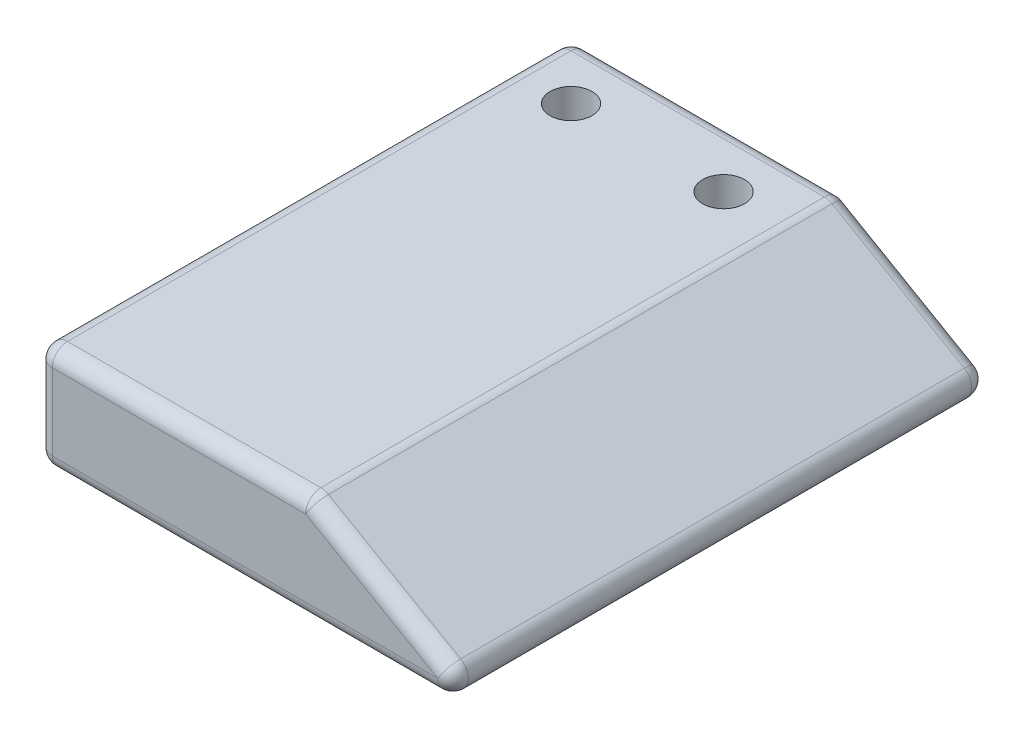
ISO-10303-21;
HEADER;
FILE_DESCRIPTION(('STEP AP214'),'2;1');
FILE_NAME('part.step','',(''),(''),'','','');
FILE_SCHEMA(('AUTOMOTIVE_DESIGN { 1 0 10303 214 1 1 1 1 }'));
ENDSEC;
DATA;
#1=APPLICATION_CONTEXT('core data for automotive mechanical design processes');
#2=APPLICATION_PROTOCOL_DEFINITION('international standard','automotive_design',2000,#1);
#3=PRODUCT_CONTEXT('',#1,'mechanical');
#4=PRODUCT('Part','Part','',(#3));
#5=PRODUCT_RELATED_PRODUCT_CATEGORY('part','',(#4));
#6=PRODUCT_DEFINITION_FORMATION('','',#4);
#7=PRODUCT_DEFINITION_CONTEXT('part definition',#1,'design');
#8=PRODUCT_DEFINITION('design','',#6,#7);
#9=PRODUCT_DEFINITION_SHAPE('','',#8);
#10=(LENGTH_UNIT() NAMED_UNIT(*) SI_UNIT(.MILLI.,.METRE.));
#11=(NAMED_UNIT(*) PLANE_ANGLE_UNIT() SI_UNIT($,.RADIAN.));
#12=(NAMED_UNIT(*) SI_UNIT($,.STERADIAN.) SOLID_ANGLE_UNIT());
#13=UNCERTAINTY_MEASURE_WITH_UNIT(LENGTH_MEASURE(1.E-05),#10,'distance_accuracy_value','');
#14=(GEOMETRIC_REPRESENTATION_CONTEXT(3) GLOBAL_UNCERTAINTY_ASSIGNED_CONTEXT((#13)) GLOBAL_UNIT_ASSIGNED_CONTEXT((#10,
#11,#12)) REPRESENTATION_CONTEXT('',''));
#15=CARTESIAN_POINT('',(0.,0.,0.));
#16=DIRECTION('',(0.,0.,1.));
#17=DIRECTION('',(1.,0.,0.));
#18=AXIS2_PLACEMENT_3D('',#15,#16,#17);
#19=CARTESIAN_POINT('',(60.,0.,70.));
#20=DIRECTION('',(0.,1.,0.));
#21=DIRECTION('',(0.,0.,1.));
#22=AXIS2_PLACEMENT_3D('',#19,#20,#21);
#23=PLANE('',#22);
#24=DIRECTION('',(1.,0.,0.));
#25=VECTOR('',#24,1.);
#26=CARTESIAN_POINT('',(60.,0.,2.));
#27=LINE('',#26,#25);
#28=CARTESIAN_POINT('',(2.,0.,2.));
#29=VERTEX_POINT('',#28);
#30=CARTESIAN_POINT('',(52.5358983848623,0.,2.));
#31=VERTEX_POINT('',#30);
#32=EDGE_CURVE('E187',#29,#31,#27,.T.);
#33=ORIENTED_EDGE('',*,*,#32,.T.);
#34=DIRECTION('',(0.,0.,-1.));
#35=VECTOR('',#34,1.);
#36=CARTESIAN_POINT('',(52.5358983848623,0.,70.));
#37=LINE('',#36,#35);
#38=CARTESIAN_POINT('',(52.5358983848623,0.,68.));
#39=VERTEX_POINT('',#38);
#40=EDGE_CURVE('E190',#31,#39,#37,.F.);
#41=ORIENTED_EDGE('',*,*,#40,.T.);
#42=DIRECTION('',(1.,0.,0.));
#43=VECTOR('',#42,1.);
#44=CARTESIAN_POINT('',(60.,0.,68.));
#45=LINE('',#44,#43);
#46=CARTESIAN_POINT('',(2.,0.,68.));
#47=VERTEX_POINT('',#46);
#48=EDGE_CURVE('E184',#39,#47,#45,.F.);
#49=ORIENTED_EDGE('',*,*,#48,.T.);
#50=DIRECTION('',(0.,0.,-1.));
#51=VECTOR('',#50,1.);
#52=CARTESIAN_POINT('',(2.,0.,70.));
#53=LINE('',#52,#51);
#54=EDGE_CURVE('E181',#47,#29,#53,.T.);
#55=ORIENTED_EDGE('',*,*,#54,.T.);
#56=EDGE_LOOP('',(#33,#41,#49,#55));
#57=FACE_BOUND('',#56,.T.);
#58=CARTESIAN_POINT('',(8.,0.,8.));
#59=DIRECTION('',(0.,-1.,0.));
#60=DIRECTION('',(0.,0.,-1.));
#61=AXIS2_PLACEMENT_3D('',#58,#59,#60);
#62=CIRCLE('',#61,5.6);
#63=CARTESIAN_POINT('',(8.,0.,2.4));
#64=VERTEX_POINT('',#63);
#65=EDGE_CURVE('E314',#64,#64,#62,.T.);
#66=ORIENTED_EDGE('',*,*,#65,.F.);
#67=EDGE_LOOP('',(#66));
#68=FACE_BOUND('',#67,.T.);
#69=CARTESIAN_POINT('',(28.,0.,8.));
#70=DIRECTION('',(0.,-1.,0.));
#71=DIRECTION('',(0.,0.,-1.));
#72=AXIS2_PLACEMENT_3D('',#69,#70,#71);
#73=CIRCLE('',#72,5.6);
#74=CARTESIAN_POINT('',(28.,0.,2.4));
#75=VERTEX_POINT('',#74);
#76=EDGE_CURVE('E333',#75,#75,#73,.T.);
#77=ORIENTED_EDGE('',*,*,#76,.F.);
#78=EDGE_LOOP('',(#77));
#79=FACE_BOUND('',#78,.T.);
#80=ADVANCED_FACE('F38',(#57,#68,#79),#23,.F.);
#81=CARTESIAN_POINT('',(35.7512886940358,14.,70.));
#82=DIRECTION('',(-0.500000000000001,-0.866025403784438,0.));
#83=DIRECTION('',(0.866025403784438,-0.500000000000001,0.));
#84=AXIS2_PLACEMENT_3D('',#81,#82,#83);
#85=PLANE('',#84);
#86=DIRECTION('',(0.,0.,-1.));
#87=VECTOR('',#86,1.);
#88=CARTESIAN_POINT('',(53.5358983848623,3.73205080756888,70.));
#89=LINE('',#88,#87);
#90=CARTESIAN_POINT('',(53.5358983848623,3.73205080756887,68.));
#91=VERTEX_POINT('',#90);
#92=CARTESIAN_POINT('',(53.5358983848623,3.73205080756887,2.));
#93=VERTEX_POINT('',#92);
#94=EDGE_CURVE('E139',#91,#93,#89,.T.);
#95=ORIENTED_EDGE('',*,*,#94,.T.);
#96=DIRECTION('',(-0.866025403784438,0.500000000000001,0.));
#97=VECTOR('',#96,1.);
#98=CARTESIAN_POINT('',(35.7512886940358,14.,2.));
#99=LINE('',#98,#97);
#100=CARTESIAN_POINT('',(36.2153903091736,13.7320508075689,2.));
#101=VERTEX_POINT('',#100);
#102=EDGE_CURVE('E134',#93,#101,#99,.T.);
#103=ORIENTED_EDGE('',*,*,#102,.T.);
#104=DIRECTION('',(0.,0.,-1.));
#105=VECTOR('',#104,1.);
#106=CARTESIAN_POINT('',(36.2153903091736,13.7320508075689,70.));
#107=LINE('',#106,#105);
#108=CARTESIAN_POINT('',(36.2153903091736,13.7320508075689,68.));
#109=VERTEX_POINT('',#108);
#110=EDGE_CURVE('E126',#101,#109,#107,.F.);
#111=ORIENTED_EDGE('',*,*,#110,.T.);
#112=DIRECTION('',(-0.866025403784438,0.500000000000001,0.));
#113=VECTOR('',#112,1.);
#114=CARTESIAN_POINT('',(35.7512886940358,14.,68.));
#115=LINE('',#114,#113);
#116=EDGE_CURVE('E131',#109,#91,#115,.F.);
#117=ORIENTED_EDGE('',*,*,#116,.T.);
#118=EDGE_LOOP('',(#95,#103,#111,#117));
#119=FACE_BOUND('',#118,.T.);
#120=ADVANCED_FACE('F129',(#119),#85,.F.);
#121=CARTESIAN_POINT('',(0.,14.,70.));
#122=DIRECTION('',(0.,-1.,0.));
#123=DIRECTION('',(0.,0.,-1.));
#124=AXIS2_PLACEMENT_3D('',#121,#122,#123);
#125=PLANE('',#124);
#126=DIRECTION('',(-1.,0.,0.));
#127=VECTOR('',#126,1.);
#128=CARTESIAN_POINT('',(0.,14.,68.));
#129=LINE('',#128,#127);
#130=CARTESIAN_POINT('',(2.,14.,68.));
#131=VERTEX_POINT('',#130);
#132=CARTESIAN_POINT('',(35.2153903091736,14.,68.));
#133=VERTEX_POINT('',#132);
#134=EDGE_CURVE('E197',#131,#133,#129,.F.);
#135=ORIENTED_EDGE('',*,*,#134,.T.);
#136=DIRECTION('',(0.,0.,-1.));
#137=VECTOR('',#136,1.);
#138=CARTESIAN_POINT('',(35.2153903091736,14.,70.));
#139=LINE('',#138,#137);
#140=CARTESIAN_POINT('',(35.2153903091736,14.,2.));
#141=VERTEX_POINT('',#140);
#142=EDGE_CURVE('E147',#133,#141,#139,.T.);
#143=ORIENTED_EDGE('',*,*,#142,.T.);
#144=DIRECTION('',(-1.,0.,0.));
#145=VECTOR('',#144,1.);
#146=CARTESIAN_POINT('',(0.,14.,2.));
#147=LINE('',#146,#145);
#148=CARTESIAN_POINT('',(2.,14.,2.));
#149=VERTEX_POINT('',#148);
#150=EDGE_CURVE('E200',#141,#149,#147,.T.);
#151=ORIENTED_EDGE('',*,*,#150,.T.);
#152=DIRECTION('',(0.,0.,-1.));
#153=VECTOR('',#152,1.);
#154=CARTESIAN_POINT('',(2.,14.,70.));
#155=LINE('',#154,#153);
#156=EDGE_CURVE('E194',#149,#131,#155,.F.);
#157=ORIENTED_EDGE('',*,*,#156,.T.);
#158=EDGE_LOOP('',(#135,#143,#151,#157));
#159=FACE_BOUND('',#158,.T.);
#160=CARTESIAN_POINT('',(8.,14.,8.));
#161=DIRECTION('',(0.,-1.,0.));
#162=DIRECTION('',(0.,0.,-1.));
#163=AXIS2_PLACEMENT_3D('',#160,#161,#162);
#164=CIRCLE('',#163,2.75);
#165=CARTESIAN_POINT('',(8.,14.,5.25));
#166=VERTEX_POINT('',#165);
#167=EDGE_CURVE('E327',#166,#166,#164,.T.);
#168=ORIENTED_EDGE('',*,*,#167,.T.);
#169=EDGE_LOOP('',(#168));
#170=FACE_BOUND('',#169,.T.);
#171=CARTESIAN_POINT('',(28.,14.,8.));
#172=DIRECTION('',(0.,-1.,0.));
#173=DIRECTION('',(0.,0.,-1.));
#174=AXIS2_PLACEMENT_3D('',#171,#172,#173);
#175=CIRCLE('',#174,2.75);
#176=CARTESIAN_POINT('',(28.,14.,5.25));
#177=VERTEX_POINT('',#176);
#178=EDGE_CURVE('E169',#177,#177,#175,.T.);
#179=ORIENTED_EDGE('',*,*,#178,.T.);
#180=EDGE_LOOP('',(#179));
#181=FACE_BOUND('',#180,.T.);
#182=ADVANCED_FACE('F356',(#159,#170,#181),#125,.F.);
#183=CARTESIAN_POINT('',(0.,0.,70.));
#184=DIRECTION('',(1.,0.,0.));
#185=DIRECTION('',(0.,0.,-1.));
#186=AXIS2_PLACEMENT_3D('',#183,#184,#185);
#187=PLANE('',#186);
#188=DIRECTION('',(0.,-1.,0.));
#189=VECTOR('',#188,1.);
#190=CARTESIAN_POINT('',(0.,0.,68.));
#191=LINE('',#190,#189);
#192=CARTESIAN_POINT('',(0.,2.,68.));
#193=VERTEX_POINT('',#192);
#194=CARTESIAN_POINT('',(0.,12.,68.));
#195=VERTEX_POINT('',#194);
#196=EDGE_CURVE('E48',#193,#195,#191,.F.);
#197=ORIENTED_EDGE('',*,*,#196,.T.);
#198=DIRECTION('',(0.,0.,-1.));
#199=VECTOR('',#198,1.);
#200=CARTESIAN_POINT('',(0.,12.,70.));
#201=LINE('',#200,#199);
#202=CARTESIAN_POINT('',(0.,12.,2.));
#203=VERTEX_POINT('',#202);
#204=EDGE_CURVE('E11',#195,#203,#201,.T.);
#205=ORIENTED_EDGE('',*,*,#204,.T.);
#206=DIRECTION('',(0.,-1.,0.));
#207=VECTOR('',#206,1.);
#208=CARTESIAN_POINT('',(0.,0.,2.));
#209=LINE('',#208,#207);
#210=CARTESIAN_POINT('',(0.,2.,2.));
#211=VERTEX_POINT('',#210);
#212=EDGE_CURVE('E231',#203,#211,#209,.T.);
#213=ORIENTED_EDGE('',*,*,#212,.T.);
#214=DIRECTION('',(0.,0.,-1.));
#215=VECTOR('',#214,1.);
#216=CARTESIAN_POINT('',(0.,2.,70.));
#217=LINE('',#216,#215);
#218=EDGE_CURVE('E59',#211,#193,#217,.F.);
#219=ORIENTED_EDGE('',*,*,#218,.T.);
#220=EDGE_LOOP('',(#197,#205,#213,#219));
#221=FACE_BOUND('',#220,.T.);
#222=ADVANCED_FACE('F438',(#221),#187,.F.);
#223=CARTESIAN_POINT('',(0.,0.,70.));
#224=DIRECTION('',(0.,0.,-1.));
#225=DIRECTION('',(-1.,0.,0.));
#226=AXIS2_PLACEMENT_3D('',#223,#224,#225);
#227=PLANE('',#226);
#228=DIRECTION('',(-0.866025403784438,0.500000000000001,0.));
#229=VECTOR('',#228,1.);
#230=CARTESIAN_POINT('',(14.0000000000001,24.2487113059643,70.));
#231=LINE('',#230,#229);
#232=CARTESIAN_POINT('',(52.5358983848623,2.,70.));
#233=VERTEX_POINT('',#232);
#234=CARTESIAN_POINT('',(35.2153903091736,12.,70.));
#235=VERTEX_POINT('',#234);
#236=EDGE_CURVE('E224',#233,#235,#231,.T.);
#237=ORIENTED_EDGE('',*,*,#236,.T.);
#238=DIRECTION('',(-1.,0.,0.));
#239=VECTOR('',#238,1.);
#240=CARTESIAN_POINT('',(0.,12.,70.));
#241=LINE('',#240,#239);
#242=CARTESIAN_POINT('',(2.,12.,70.));
#243=VERTEX_POINT('',#242);
#244=EDGE_CURVE('E227',#235,#243,#241,.T.);
#245=ORIENTED_EDGE('',*,*,#244,.T.);
#246=DIRECTION('',(0.,-1.,0.));
#247=VECTOR('',#246,1.);
#248=CARTESIAN_POINT('',(2.,0.,70.));
#249=LINE('',#248,#247);
#250=CARTESIAN_POINT('',(2.,2.,70.));
#251=VERTEX_POINT('',#250);
#252=EDGE_CURVE('E218',#243,#251,#249,.T.);
#253=ORIENTED_EDGE('',*,*,#252,.T.);
#254=DIRECTION('',(1.,0.,0.));
#255=VECTOR('',#254,1.);
#256=CARTESIAN_POINT('',(0.,2.,70.));
#257=LINE('',#256,#255);
#258=EDGE_CURVE('E221',#251,#233,#257,.T.);
#259=ORIENTED_EDGE('',*,*,#258,.T.);
#260=EDGE_LOOP('',(#237,#245,#253,#259));
#261=FACE_BOUND('',#260,.T.);
#262=ADVANCED_FACE('F455',(#261),#227,.F.);
#263=CARTESIAN_POINT('',(0.,0.,0.));
#264=DIRECTION('',(0.,0.,-1.));
#265=DIRECTION('',(-1.,0.,0.));
#266=AXIS2_PLACEMENT_3D('',#263,#264,#265);
#267=PLANE('',#266);
#268=DIRECTION('',(-1.,0.,0.));
#269=VECTOR('',#268,1.);
#270=CARTESIAN_POINT('',(35.7512886940358,12.,0.));
#271=LINE('',#270,#269);
#272=CARTESIAN_POINT('',(2.,12.,0.));
#273=VERTEX_POINT('',#272);
#274=CARTESIAN_POINT('',(35.2153903091736,12.,0.));
#275=VERTEX_POINT('',#274);
#276=EDGE_CURVE('E211',#273,#275,#271,.F.);
#277=ORIENTED_EDGE('',*,*,#276,.T.);
#278=DIRECTION('',(-0.866025403784438,0.500000000000001,0.));
#279=VECTOR('',#278,1.);
#280=CARTESIAN_POINT('',(59.,-1.73205080756888,0.));
#281=LINE('',#280,#279);
#282=CARTESIAN_POINT('',(52.5358983848623,2.,0.));
#283=VERTEX_POINT('',#282);
#284=EDGE_CURVE('E214',#275,#283,#281,.F.);
#285=ORIENTED_EDGE('',*,*,#284,.T.);
#286=DIRECTION('',(1.,0.,0.));
#287=VECTOR('',#286,1.);
#288=CARTESIAN_POINT('',(0.,2.,0.));
#289=LINE('',#288,#287);
#290=CARTESIAN_POINT('',(2.,2.,0.));
#291=VERTEX_POINT('',#290);
#292=EDGE_CURVE('E208',#283,#291,#289,.F.);
#293=ORIENTED_EDGE('',*,*,#292,.T.);
#294=DIRECTION('',(0.,-1.,0.));
#295=VECTOR('',#294,1.);
#296=CARTESIAN_POINT('',(2.,14.,0.));
#297=LINE('',#296,#295);
#298=EDGE_CURVE('E205',#291,#273,#297,.F.);
#299=ORIENTED_EDGE('',*,*,#298,.T.);
#300=EDGE_LOOP('',(#277,#285,#293,#299));
#301=FACE_BOUND('',#300,.T.);
#302=ADVANCED_FACE('F457',(#301),#267,.T.);
#303=CARTESIAN_POINT('',(28.,0.,8.));
#304=DIRECTION('',(0.,-1.,0.));
#305=DIRECTION('',(0.,0.,-1.));
#306=AXIS2_PLACEMENT_3D('',#303,#304,#305);
#307=CYLINDRICAL_SURFACE('',#306,2.75);
#308=ORIENTED_EDGE('',*,*,#178,.F.);
#309=EDGE_LOOP('',(#308));
#310=FACE_BOUND('',#309,.T.);
#311=CARTESIAN_POINT('',(28.,2.85,8.));
#312=DIRECTION('',(0.,-1.,0.));
#313=DIRECTION('',(0.,0.,-1.));
#314=AXIS2_PLACEMENT_3D('',#311,#312,#313);
#315=CIRCLE('',#314,2.75);
#316=CARTESIAN_POINT('',(28.,2.85,5.25));
#317=VERTEX_POINT('',#316);
#318=EDGE_CURVE('E173',#317,#317,#315,.T.);
#319=ORIENTED_EDGE('',*,*,#318,.T.);
#320=EDGE_LOOP('',(#319));
#321=FACE_BOUND('',#320,.T.);
#322=ADVANCED_FACE('F340',(#310,#321),#307,.F.);
#323=CARTESIAN_POINT('',(28.,0.,8.));
#324=DIRECTION('',(0.,-1.,0.));
#325=DIRECTION('',(0.,0.,-1.));
#326=AXIS2_PLACEMENT_3D('',#323,#324,#325);
#327=CONICAL_SURFACE('',#326,5.6,0.785398163397449);
#328=ORIENTED_EDGE('',*,*,#318,.F.);
#329=EDGE_LOOP('',(#328));
#330=FACE_BOUND('',#329,.T.);
#331=ORIENTED_EDGE('',*,*,#76,.T.);
#332=EDGE_LOOP('',(#331));
#333=FACE_BOUND('',#332,.T.);
#334=ADVANCED_FACE('F342',(#330,#333),#327,.F.);
#335=CARTESIAN_POINT('',(8.,0.,8.));
#336=DIRECTION('',(0.,-1.,0.));
#337=DIRECTION('',(0.,0.,-1.));
#338=AXIS2_PLACEMENT_3D('',#335,#336,#337);
#339=CYLINDRICAL_SURFACE('',#338,2.75);
#340=ORIENTED_EDGE('',*,*,#167,.F.);
#341=EDGE_LOOP('',(#340));
#342=FACE_BOUND('',#341,.T.);
#343=CARTESIAN_POINT('',(8.,2.85,8.));
#344=DIRECTION('',(0.,-1.,0.));
#345=DIRECTION('',(0.,0.,-1.));
#346=AXIS2_PLACEMENT_3D('',#343,#344,#345);
#347=CIRCLE('',#346,2.75);
#348=CARTESIAN_POINT('',(8.,2.85,5.25));
#349=VERTEX_POINT('',#348);
#350=EDGE_CURVE('E321',#349,#349,#347,.T.);
#351=ORIENTED_EDGE('',*,*,#350,.T.);
#352=EDGE_LOOP('',(#351));
#353=FACE_BOUND('',#352,.T.);
#354=ADVANCED_FACE('F345',(#342,#353),#339,.F.);
#355=CARTESIAN_POINT('',(8.,0.,8.));
#356=DIRECTION('',(0.,-1.,0.));
#357=DIRECTION('',(0.,0.,-1.));
#358=AXIS2_PLACEMENT_3D('',#355,#356,#357);
#359=CONICAL_SURFACE('',#358,5.6,0.785398163397448);
#360=ORIENTED_EDGE('',*,*,#350,.F.);
#361=EDGE_LOOP('',(#360));
#362=FACE_BOUND('',#361,.T.);
#363=ORIENTED_EDGE('',*,*,#65,.T.);
#364=EDGE_LOOP('',(#363));
#365=FACE_BOUND('',#364,.T.);
#366=ADVANCED_FACE('F430',(#362,#365),#359,.F.);
#367=CARTESIAN_POINT('',(2.,12.,70.));
#368=DIRECTION('',(0.,0.,-1.));
#369=DIRECTION('',(-1.,0.,0.));
#370=AXIS2_PLACEMENT_3D('',#367,#368,#369);
#371=CYLINDRICAL_SURFACE('',#370,2.);
#372=CARTESIAN_POINT('',(2.,12.,68.));
#373=DIRECTION('',(0.,0.,1.));
#374=DIRECTION('',(1.,0.,0.));
#375=AXIS2_PLACEMENT_3D('',#372,#373,#374);
#376=CIRCLE('',#375,2.);
#377=EDGE_CURVE('E42',#131,#195,#376,.T.);
#378=ORIENTED_EDGE('',*,*,#377,.F.);
#379=ORIENTED_EDGE('',*,*,#156,.F.);
#380=CARTESIAN_POINT('',(2.,12.,2.));
#381=DIRECTION('',(0.,0.,-1.));
#382=DIRECTION('',(-1.,0.,0.));
#383=AXIS2_PLACEMENT_3D('',#380,#381,#382);
#384=CIRCLE('',#383,2.);
#385=EDGE_CURVE('E305',#203,#149,#384,.T.);
#386=ORIENTED_EDGE('',*,*,#385,.F.);
#387=ORIENTED_EDGE('',*,*,#204,.F.);
#388=EDGE_LOOP('',(#378,#379,#386,#387));
#389=FACE_BOUND('',#388,.T.);
#390=ADVANCED_FACE('F40',(#389),#371,.T.);
#391=CARTESIAN_POINT('',(2.,12.,68.));
#392=DIRECTION('',(0.,0.,1.));
#393=DIRECTION('',(1.,0.,0.));
#394=AXIS2_PLACEMENT_3D('',#391,#392,#393);
#395=SPHERICAL_SURFACE('',#394,2.);
#396=CARTESIAN_POINT('',(2.,12.,68.));
#397=DIRECTION('',(-1.,0.,0.));
#398=DIRECTION('',(0.,0.,1.));
#399=AXIS2_PLACEMENT_3D('',#396,#397,#398);
#400=CIRCLE('',#399,2.);
#401=EDGE_CURVE('E298',#131,#243,#400,.F.);
#402=ORIENTED_EDGE('',*,*,#401,.F.);
#403=ORIENTED_EDGE('',*,*,#377,.T.);
#404=CARTESIAN_POINT('',(2.,12.,68.));
#405=DIRECTION('',(0.,1.,0.));
#406=DIRECTION('',(0.,0.,1.));
#407=AXIS2_PLACEMENT_3D('',#404,#405,#406);
#408=CIRCLE('',#407,2.);
#409=EDGE_CURVE('E302',#243,#195,#408,.F.);
#410=ORIENTED_EDGE('',*,*,#409,.F.);
#411=EDGE_LOOP('',(#402,#403,#410));
#412=FACE_BOUND('',#411,.T.);
#413=ADVANCED_FACE('F425',(#412),#395,.T.);
#414=CARTESIAN_POINT('',(2.,12.,2.));
#415=DIRECTION('',(0.,0.,1.));
#416=DIRECTION('',(1.,0.,0.));
#417=AXIS2_PLACEMENT_3D('',#414,#415,#416);
#418=SPHERICAL_SURFACE('',#417,2.);
#419=CARTESIAN_POINT('',(2.,12.,2.));
#420=DIRECTION('',(0.,1.,0.));
#421=DIRECTION('',(0.,0.,1.));
#422=AXIS2_PLACEMENT_3D('',#419,#420,#421);
#423=CIRCLE('',#422,2.);
#424=EDGE_CURVE('E290',#203,#273,#423,.F.);
#425=ORIENTED_EDGE('',*,*,#424,.F.);
#426=ORIENTED_EDGE('',*,*,#385,.T.);
#427=CARTESIAN_POINT('',(2.,12.,2.));
#428=DIRECTION('',(-1.,0.,0.));
#429=DIRECTION('',(0.,0.,1.));
#430=AXIS2_PLACEMENT_3D('',#427,#428,#429);
#431=CIRCLE('',#430,2.);
#432=EDGE_CURVE('E294',#273,#149,#431,.F.);
#433=ORIENTED_EDGE('',*,*,#432,.F.);
#434=EDGE_LOOP('',(#425,#426,#433));
#435=FACE_BOUND('',#434,.T.);
#436=ADVANCED_FACE('F422',(#435),#418,.T.);
#437=CARTESIAN_POINT('',(2.,0.,68.));
#438=DIRECTION('',(0.,-1.,0.));
#439=DIRECTION('',(0.,0.,-1.));
#440=AXIS2_PLACEMENT_3D('',#437,#438,#439);
#441=CYLINDRICAL_SURFACE('',#440,2.);
#442=ORIENTED_EDGE('',*,*,#409,.T.);
#443=ORIENTED_EDGE('',*,*,#196,.F.);
#444=CARTESIAN_POINT('',(2.,2.,68.));
#445=DIRECTION('',(0.,-1.,0.));
#446=DIRECTION('',(0.,0.,-1.));
#447=AXIS2_PLACEMENT_3D('',#444,#445,#446);
#448=CIRCLE('',#447,2.);
#449=EDGE_CURVE('E282',#251,#193,#448,.T.);
#450=ORIENTED_EDGE('',*,*,#449,.F.);
#451=ORIENTED_EDGE('',*,*,#252,.F.);
#452=EDGE_LOOP('',(#442,#443,#450,#451));
#453=FACE_BOUND('',#452,.T.);
#454=ADVANCED_FACE('F418',(#453),#441,.T.);
#455=CARTESIAN_POINT('',(0.,12.,68.));
#456=DIRECTION('',(-1.,0.,0.));
#457=DIRECTION('',(0.,0.,1.));
#458=AXIS2_PLACEMENT_3D('',#455,#456,#457);
#459=CYLINDRICAL_SURFACE('',#458,2.);
#460=ORIENTED_EDGE('',*,*,#401,.T.);
#461=ORIENTED_EDGE('',*,*,#244,.F.);
#462=CARTESIAN_POINT('',(35.2153903091736,12.,68.));
#463=DIRECTION('',(1.,0.,0.));
#464=DIRECTION('',(0.,0.,-1.));
#465=AXIS2_PLACEMENT_3D('',#462,#463,#464);
#466=CIRCLE('',#465,2.);
#467=EDGE_CURVE('E152',#133,#235,#466,.T.);
#468=ORIENTED_EDGE('',*,*,#467,.F.);
#469=ORIENTED_EDGE('',*,*,#134,.F.);
#470=EDGE_LOOP('',(#460,#461,#468,#469));
#471=FACE_BOUND('',#470,.T.);
#472=ADVANCED_FACE('F415',(#471),#459,.T.);
#473=CARTESIAN_POINT('',(35.2153903091736,12.,70.));
#474=DIRECTION('',(0.,0.,-1.));
#475=DIRECTION('',(-1.,0.,0.));
#476=AXIS2_PLACEMENT_3D('',#473,#474,#475);
#477=CYLINDRICAL_SURFACE('',#476,2.);
#478=CARTESIAN_POINT('',(35.2153903091736,12.,2.));
#479=DIRECTION('',(0.,0.,-1.));
#480=DIRECTION('',(-1.,0.,0.));
#481=AXIS2_PLACEMENT_3D('',#478,#479,#480);
#482=CIRCLE('',#481,2.);
#483=EDGE_CURVE('E153',#141,#101,#482,.T.);
#484=ORIENTED_EDGE('',*,*,#483,.F.);
#485=ORIENTED_EDGE('',*,*,#142,.F.);
#486=CARTESIAN_POINT('',(35.2153903091736,12.,68.));
#487=DIRECTION('',(0.,0.,1.));
#488=DIRECTION('',(1.,0.,0.));
#489=AXIS2_PLACEMENT_3D('',#486,#487,#488);
#490=CIRCLE('',#489,2.);
#491=EDGE_CURVE('E143',#109,#133,#490,.T.);
#492=ORIENTED_EDGE('',*,*,#491,.F.);
#493=ORIENTED_EDGE('',*,*,#110,.F.);
#494=EDGE_LOOP('',(#484,#485,#492,#493));
#495=FACE_BOUND('',#494,.T.);
#496=ADVANCED_FACE('F145',(#495),#477,.T.);
#497=CARTESIAN_POINT('',(0.,12.,2.));
#498=DIRECTION('',(1.,0.,0.));
#499=DIRECTION('',(0.,0.,-1.));
#500=AXIS2_PLACEMENT_3D('',#497,#498,#499);
#501=CYLINDRICAL_SURFACE('',#500,2.);
#502=ORIENTED_EDGE('',*,*,#432,.T.);
#503=ORIENTED_EDGE('',*,*,#150,.F.);
#504=CARTESIAN_POINT('',(35.2153903091736,12.,2.));
#505=DIRECTION('',(1.,0.,0.));
#506=DIRECTION('',(0.,0.,-1.));
#507=AXIS2_PLACEMENT_3D('',#504,#505,#506);
#508=CIRCLE('',#507,2.);
#509=EDGE_CURVE('E275',#275,#141,#508,.T.);
#510=ORIENTED_EDGE('',*,*,#509,.F.);
#511=ORIENTED_EDGE('',*,*,#276,.F.);
#512=EDGE_LOOP('',(#502,#503,#510,#511));
#513=FACE_BOUND('',#512,.T.);
#514=ADVANCED_FACE('F408',(#513),#501,.T.);
#515=CARTESIAN_POINT('',(2.,0.,2.));
#516=DIRECTION('',(0.,1.,0.));
#517=DIRECTION('',(0.,0.,1.));
#518=AXIS2_PLACEMENT_3D('',#515,#516,#517);
#519=CYLINDRICAL_SURFACE('',#518,2.);
#520=ORIENTED_EDGE('',*,*,#424,.T.);
#521=ORIENTED_EDGE('',*,*,#298,.F.);
#522=CARTESIAN_POINT('',(2.,2.,2.));
#523=DIRECTION('',(0.,-1.,0.));
#524=DIRECTION('',(0.,0.,-1.));
#525=AXIS2_PLACEMENT_3D('',#522,#523,#524);
#526=CIRCLE('',#525,2.);
#527=EDGE_CURVE('E271',#211,#291,#526,.T.);
#528=ORIENTED_EDGE('',*,*,#527,.F.);
#529=ORIENTED_EDGE('',*,*,#212,.F.);
#530=EDGE_LOOP('',(#520,#521,#528,#529));
#531=FACE_BOUND('',#530,.T.);
#532=ADVANCED_FACE('F404',(#531),#519,.T.);
#533=CARTESIAN_POINT('',(2.,2.,70.));
#534=DIRECTION('',(0.,0.,-1.));
#535=DIRECTION('',(-1.,0.,0.));
#536=AXIS2_PLACEMENT_3D('',#533,#534,#535);
#537=CYLINDRICAL_SURFACE('',#536,2.);
#538=CARTESIAN_POINT('',(2.,2.,68.));
#539=DIRECTION('',(0.,0.,1.));
#540=DIRECTION('',(1.,0.,0.));
#541=AXIS2_PLACEMENT_3D('',#538,#539,#540);
#542=CIRCLE('',#541,2.);
#543=EDGE_CURVE('E286',#193,#47,#542,.T.);
#544=ORIENTED_EDGE('',*,*,#543,.F.);
#545=ORIENTED_EDGE('',*,*,#218,.F.);
#546=CARTESIAN_POINT('',(2.,2.,2.));
#547=DIRECTION('',(0.,0.,-1.));
#548=DIRECTION('',(-1.,0.,0.));
#549=AXIS2_PLACEMENT_3D('',#546,#547,#548);
#550=CIRCLE('',#549,2.);
#551=EDGE_CURVE('E267',#29,#211,#550,.T.);
#552=ORIENTED_EDGE('',*,*,#551,.F.);
#553=ORIENTED_EDGE('',*,*,#54,.F.);
#554=EDGE_LOOP('',(#544,#545,#552,#553));
#555=FACE_BOUND('',#554,.T.);
#556=ADVANCED_FACE('F400',(#555),#537,.T.);
#557=CARTESIAN_POINT('',(2.,2.,68.));
#558=DIRECTION('',(0.,0.,1.));
#559=DIRECTION('',(1.,0.,0.));
#560=AXIS2_PLACEMENT_3D('',#557,#558,#559);
#561=SPHERICAL_SURFACE('',#560,2.);
#562=ORIENTED_EDGE('',*,*,#449,.T.);
#563=ORIENTED_EDGE('',*,*,#543,.T.);
#564=CARTESIAN_POINT('',(2.,2.,68.));
#565=DIRECTION('',(-1.,0.,0.));
#566=DIRECTION('',(0.,0.,1.));
#567=AXIS2_PLACEMENT_3D('',#564,#565,#566);
#568=CIRCLE('',#567,2.);
#569=EDGE_CURVE('E161',#251,#47,#568,.F.);
#570=ORIENTED_EDGE('',*,*,#569,.F.);
#571=EDGE_LOOP('',(#562,#563,#570));
#572=FACE_BOUND('',#571,.T.);
#573=ADVANCED_FACE('F397',(#572),#561,.T.);
#574=CARTESIAN_POINT('',(35.2153903091736,12.,68.));
#575=DIRECTION('',(0.,0.,1.));
#576=DIRECTION('',(1.,0.,0.));
#577=AXIS2_PLACEMENT_3D('',#574,#575,#576);
#578=SPHERICAL_SURFACE('',#577,2.);
#579=ORIENTED_EDGE('',*,*,#491,.T.);
#580=ORIENTED_EDGE('',*,*,#467,.T.);
#581=CARTESIAN_POINT('',(35.2153903091736,12.,68.));
#582=DIRECTION('',(-0.866025403784437,0.500000000000003,0.));
#583=DIRECTION('',(-0.500000000000003,-0.866025403784437,0.));
#584=AXIS2_PLACEMENT_3D('',#581,#582,#583);
#585=CIRCLE('',#584,2.);
#586=EDGE_CURVE('E156',#109,#235,#585,.F.);
#587=ORIENTED_EDGE('',*,*,#586,.F.);
#588=EDGE_LOOP('',(#579,#580,#587));
#589=FACE_BOUND('',#588,.T.);
#590=ADVANCED_FACE('F157',(#589),#578,.T.);
#591=CARTESIAN_POINT('',(35.2153903091736,12.,2.));
#592=DIRECTION('',(0.,0.,1.));
#593=DIRECTION('',(1.,0.,0.));
#594=AXIS2_PLACEMENT_3D('',#591,#592,#593);
#595=SPHERICAL_SURFACE('',#594,2.);
#596=ORIENTED_EDGE('',*,*,#509,.T.);
#597=ORIENTED_EDGE('',*,*,#483,.T.);
#598=CARTESIAN_POINT('',(35.2153903091736,12.,2.));
#599=DIRECTION('',(-0.866025403784438,0.500000000000001,0.));
#600=DIRECTION('',(-0.500000000000001,-0.866025403784438,0.));
#601=AXIS2_PLACEMENT_3D('',#598,#599,#600);
#602=CIRCLE('',#601,2.);
#603=EDGE_CURVE('E162',#275,#101,#602,.F.);
#604=ORIENTED_EDGE('',*,*,#603,.F.);
#605=EDGE_LOOP('',(#596,#597,#604));
#606=FACE_BOUND('',#605,.T.);
#607=ADVANCED_FACE('F390',(#606),#595,.T.);
#608=CARTESIAN_POINT('',(2.,2.,2.));
#609=DIRECTION('',(0.,0.,1.));
#610=DIRECTION('',(1.,0.,0.));
#611=AXIS2_PLACEMENT_3D('',#608,#609,#610);
#612=SPHERICAL_SURFACE('',#611,2.);
#613=ORIENTED_EDGE('',*,*,#551,.T.);
#614=ORIENTED_EDGE('',*,*,#527,.T.);
#615=CARTESIAN_POINT('',(2.,2.,2.));
#616=DIRECTION('',(-1.,0.,0.));
#617=DIRECTION('',(0.,-1.,0.));
#618=AXIS2_PLACEMENT_3D('',#615,#616,#617);
#619=CIRCLE('',#618,2.);
#620=EDGE_CURVE('E257',#29,#291,#619,.F.);
#621=ORIENTED_EDGE('',*,*,#620,.F.);
#622=EDGE_LOOP('',(#613,#614,#621));
#623=FACE_BOUND('',#622,.T.);
#624=ADVANCED_FACE('F386',(#623),#612,.T.);
#625=CARTESIAN_POINT('',(0.,2.,68.));
#626=DIRECTION('',(1.,0.,0.));
#627=DIRECTION('',(0.,0.,-1.));
#628=AXIS2_PLACEMENT_3D('',#625,#626,#627);
#629=CYLINDRICAL_SURFACE('',#628,2.);
#630=ORIENTED_EDGE('',*,*,#569,.T.);
#631=ORIENTED_EDGE('',*,*,#48,.F.);
#632=CARTESIAN_POINT('',(52.5358983848623,2.,68.));
#633=DIRECTION('',(1.,0.,0.));
#634=DIRECTION('',(0.,1.,0.));
#635=AXIS2_PLACEMENT_3D('',#632,#633,#634);
#636=CIRCLE('',#635,2.);
#637=EDGE_CURVE('E253',#233,#39,#636,.T.);
#638=ORIENTED_EDGE('',*,*,#637,.F.);
#639=ORIENTED_EDGE('',*,*,#258,.F.);
#640=EDGE_LOOP('',(#630,#631,#638,#639));
#641=FACE_BOUND('',#640,.T.);
#642=ADVANCED_FACE('F383',(#641),#629,.T.);
#643=CARTESIAN_POINT('',(14.0000000000001,24.2487113059643,68.));
#644=DIRECTION('',(-0.866025403784438,0.500000000000001,0.));
#645=DIRECTION('',(-0.500000000000001,-0.866025403784438,0.));
#646=AXIS2_PLACEMENT_3D('',#643,#644,#645);
#647=CYLINDRICAL_SURFACE('',#646,2.);
#648=ORIENTED_EDGE('',*,*,#586,.T.);
#649=ORIENTED_EDGE('',*,*,#236,.F.);
#650=CARTESIAN_POINT('',(52.5358983848623,2.,68.));
#651=DIRECTION('',(0.866025403784438,-0.500000000000001,0.));
#652=DIRECTION('',(0.500000000000001,0.866025403784438,0.));
#653=AXIS2_PLACEMENT_3D('',#650,#651,#652);
#654=CIRCLE('',#653,2.);
#655=EDGE_CURVE('E166',#91,#233,#654,.T.);
#656=ORIENTED_EDGE('',*,*,#655,.F.);
#657=ORIENTED_EDGE('',*,*,#116,.F.);
#658=EDGE_LOOP('',(#648,#649,#656,#657));
#659=FACE_BOUND('',#658,.T.);
#660=ADVANCED_FACE('F164',(#659),#647,.T.);
#661=CARTESIAN_POINT('',(34.7512886940358,12.2679491924311,2.));
#662=DIRECTION('',(0.866025403784438,-0.500000000000001,0.));
#663=DIRECTION('',(0.500000000000001,0.866025403784438,0.));
#664=AXIS2_PLACEMENT_3D('',#661,#662,#663);
#665=CYLINDRICAL_SURFACE('',#664,2.);
#666=ORIENTED_EDGE('',*,*,#603,.T.);
#667=ORIENTED_EDGE('',*,*,#102,.F.);
#668=CARTESIAN_POINT('',(52.5358983848623,2.,2.));
#669=DIRECTION('',(0.866025403784436,-0.500000000000003,0.));
#670=DIRECTION('',(0.500000000000004,0.866025403784437,0.));
#671=AXIS2_PLACEMENT_3D('',#668,#669,#670);
#672=CIRCLE('',#671,2.);
#673=EDGE_CURVE('E247',#283,#93,#672,.T.);
#674=ORIENTED_EDGE('',*,*,#673,.F.);
#675=ORIENTED_EDGE('',*,*,#284,.F.);
#676=EDGE_LOOP('',(#666,#667,#674,#675));
#677=FACE_BOUND('',#676,.T.);
#678=ADVANCED_FACE('F376',(#677),#665,.T.);
#679=CARTESIAN_POINT('',(60.,2.,2.));
#680=DIRECTION('',(-1.,0.,0.));
#681=DIRECTION('',(0.,0.,1.));
#682=AXIS2_PLACEMENT_3D('',#679,#680,#681);
#683=CYLINDRICAL_SURFACE('',#682,2.);
#684=ORIENTED_EDGE('',*,*,#620,.T.);
#685=ORIENTED_EDGE('',*,*,#292,.F.);
#686=CARTESIAN_POINT('',(52.5358983848623,2.,2.));
#687=DIRECTION('',(1.,0.,0.));
#688=DIRECTION('',(0.,0.,-1.));
#689=AXIS2_PLACEMENT_3D('',#686,#687,#688);
#690=CIRCLE('',#689,2.);
#691=EDGE_CURVE('E244',#31,#283,#690,.T.);
#692=ORIENTED_EDGE('',*,*,#691,.F.);
#693=ORIENTED_EDGE('',*,*,#32,.F.);
#694=EDGE_LOOP('',(#684,#685,#692,#693));
#695=FACE_BOUND('',#694,.T.);
#696=ADVANCED_FACE('F372',(#695),#683,.T.);
#697=CARTESIAN_POINT('',(52.5358983848623,2.,68.));
#698=DIRECTION('',(0.,0.,1.));
#699=DIRECTION('',(1.,0.,0.));
#700=AXIS2_PLACEMENT_3D('',#697,#698,#699);
#701=SPHERICAL_SURFACE('',#700,2.);
#702=ORIENTED_EDGE('',*,*,#655,.T.);
#703=ORIENTED_EDGE('',*,*,#637,.T.);
#704=CARTESIAN_POINT('',(52.5358983848623,2.,68.));
#705=DIRECTION('',(0.,0.,1.));
#706=DIRECTION('',(1.,0.,0.));
#707=AXIS2_PLACEMENT_3D('',#704,#705,#706);
#708=CIRCLE('',#707,2.);
#709=EDGE_CURVE('E241',#91,#39,#708,.F.);
#710=ORIENTED_EDGE('',*,*,#709,.F.);
#711=EDGE_LOOP('',(#702,#703,#710));
#712=FACE_BOUND('',#711,.T.);
#713=ADVANCED_FACE('F368',(#712),#701,.T.);
#714=CARTESIAN_POINT('',(52.5358983848623,2.,2.));
#715=DIRECTION('',(0.,0.,1.));
#716=DIRECTION('',(1.,0.,0.));
#717=AXIS2_PLACEMENT_3D('',#714,#715,#716);
#718=SPHERICAL_SURFACE('',#717,2.);
#719=ORIENTED_EDGE('',*,*,#691,.T.);
#720=ORIENTED_EDGE('',*,*,#673,.T.);
#721=CARTESIAN_POINT('',(52.5358983848623,2.,2.));
#722=DIRECTION('',(0.,0.,-1.));
#723=DIRECTION('',(-1.,0.,0.));
#724=AXIS2_PLACEMENT_3D('',#721,#722,#723);
#725=CIRCLE('',#724,2.);
#726=EDGE_CURVE('E238',#31,#93,#725,.F.);
#727=ORIENTED_EDGE('',*,*,#726,.F.);
#728=EDGE_LOOP('',(#719,#720,#727));
#729=FACE_BOUND('',#728,.T.);
#730=ADVANCED_FACE('F364',(#729),#718,.T.);
#731=CARTESIAN_POINT('',(52.5358983848623,2.,70.));
#732=DIRECTION('',(0.,0.,-1.));
#733=DIRECTION('',(-1.,0.,0.));
#734=AXIS2_PLACEMENT_3D('',#731,#732,#733);
#735=CYLINDRICAL_SURFACE('',#734,2.);
#736=ORIENTED_EDGE('',*,*,#709,.T.);
#737=ORIENTED_EDGE('',*,*,#40,.F.);
#738=ORIENTED_EDGE('',*,*,#726,.T.);
#739=ORIENTED_EDGE('',*,*,#94,.F.);
#740=EDGE_LOOP('',(#736,#737,#738,#739));
#741=FACE_BOUND('',#740,.T.);
#742=ADVANCED_FACE('F361',(#741),#735,.T.);
#743=CLOSED_SHELL('',(#80,#120,#182,#222,#262,#302,#322,#334,#354,#366,#390,#413,#436,#454,#472,
#496,#514,#532,#556,#573,#590,#607,#624,#642,#660,#678,#696,#713,#730,#742));
#744=MANIFOLD_SOLID_BREP('B2',#743);
#745=ADVANCED_BREP_SHAPE_REPRESENTATION('',(#18,#744),#14);
#746=SHAPE_DEFINITION_REPRESENTATION(#9,#745);
ENDSEC;
END-ISO-10303-21;
